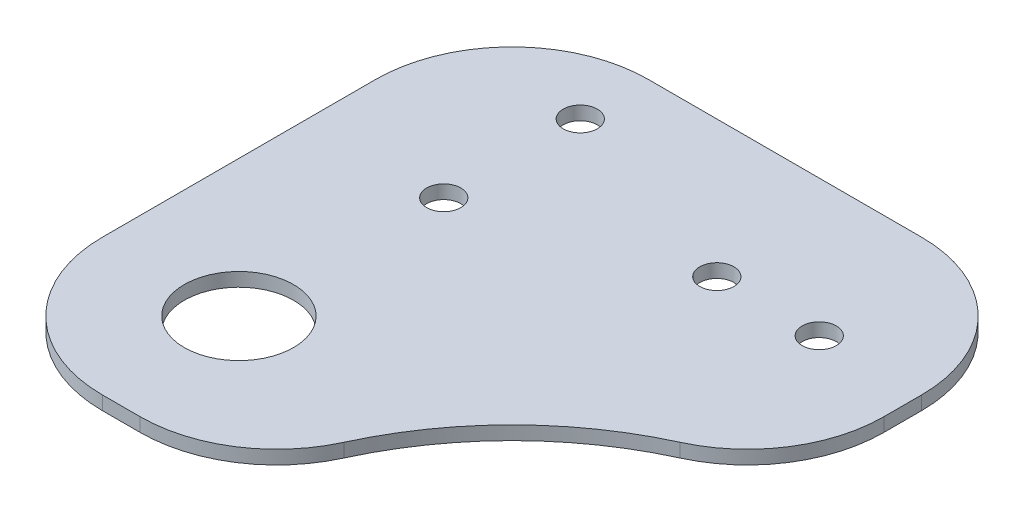
ISO-10303-21;
HEADER;
FILE_DESCRIPTION(('STEP AP214'),'2;1');
FILE_NAME('part.step','',(''),(''),'','','');
FILE_SCHEMA(('AUTOMOTIVE_DESIGN { 1 0 10303 214 1 1 1 1 }'));
ENDSEC;
DATA;
#1=APPLICATION_CONTEXT('core data for automotive mechanical design processes');
#2=APPLICATION_PROTOCOL_DEFINITION('international standard','automotive_design',2000,#1);
#3=PRODUCT_CONTEXT('',#1,'mechanical');
#4=PRODUCT('Part','Part','',(#3));
#5=PRODUCT_RELATED_PRODUCT_CATEGORY('part','',(#4));
#6=PRODUCT_DEFINITION_FORMATION('','',#4);
#7=PRODUCT_DEFINITION_CONTEXT('part definition',#1,'design');
#8=PRODUCT_DEFINITION('design','',#6,#7);
#9=PRODUCT_DEFINITION_SHAPE('','',#8);
#10=(LENGTH_UNIT() NAMED_UNIT(*) SI_UNIT(.MILLI.,.METRE.));
#11=(NAMED_UNIT(*) PLANE_ANGLE_UNIT() SI_UNIT($,.RADIAN.));
#12=(NAMED_UNIT(*) SI_UNIT($,.STERADIAN.) SOLID_ANGLE_UNIT());
#13=UNCERTAINTY_MEASURE_WITH_UNIT(LENGTH_MEASURE(1.E-05),#10,'distance_accuracy_value','');
#14=(GEOMETRIC_REPRESENTATION_CONTEXT(3) GLOBAL_UNCERTAINTY_ASSIGNED_CONTEXT((#13)) GLOBAL_UNIT_ASSIGNED_CONTEXT((#10,
#11,#12)) REPRESENTATION_CONTEXT('',''));
#15=CARTESIAN_POINT('',(0.,0.,0.));
#16=DIRECTION('',(0.,0.,1.));
#17=DIRECTION('',(1.,0.,0.));
#18=AXIS2_PLACEMENT_3D('',#15,#16,#17);
#19=CARTESIAN_POINT('',(0.,2.,-40.));
#20=DIRECTION('',(0.,0.,1.));
#21=DIRECTION('',(1.,0.,0.));
#22=AXIS2_PLACEMENT_3D('',#19,#20,#21);
#23=PLANE('',#22);
#24=DIRECTION('',(-1.,0.,0.));
#25=VECTOR('',#24,1.);
#26=CARTESIAN_POINT('',(0.,0.,-40.));
#27=LINE('',#26,#25);
#28=CARTESIAN_POINT('',(60.,0.,-40.));
#29=VERTEX_POINT('',#28);
#30=CARTESIAN_POINT('',(20.,0.,-40.));
#31=VERTEX_POINT('',#30);
#32=EDGE_CURVE('E143',#29,#31,#27,.T.);
#33=ORIENTED_EDGE('',*,*,#32,.T.);
#34=DIRECTION('',(0.,-1.,0.));
#35=VECTOR('',#34,1.);
#36=CARTESIAN_POINT('',(20.,2.,-40.));
#37=LINE('',#36,#35);
#38=CARTESIAN_POINT('',(20.,2.,-40.));
#39=VERTEX_POINT('',#38);
#40=EDGE_CURVE('E119',#31,#39,#37,.F.);
#41=ORIENTED_EDGE('',*,*,#40,.T.);
#42=DIRECTION('',(-1.,0.,0.));
#43=VECTOR('',#42,1.);
#44=CARTESIAN_POINT('',(0.,2.,-40.));
#45=LINE('',#44,#43);
#46=CARTESIAN_POINT('',(60.,2.,-40.));
#47=VERTEX_POINT('',#46);
#48=EDGE_CURVE('E284',#47,#39,#45,.T.);
#49=ORIENTED_EDGE('',*,*,#48,.F.);
#50=DIRECTION('',(0.,-1.,0.));
#51=VECTOR('',#50,1.);
#52=CARTESIAN_POINT('',(60.,0.,-40.));
#53=LINE('',#52,#51);
#54=EDGE_CURVE('E124',#47,#29,#53,.T.);
#55=ORIENTED_EDGE('',*,*,#54,.T.);
#56=EDGE_LOOP('',(#33,#41,#49,#55));
#57=FACE_BOUND('',#56,.T.);
#58=ADVANCED_FACE('F35',(#57),#23,.F.);
#59=CARTESIAN_POINT('',(0.,2.,0.));
#60=DIRECTION('',(1.,0.,0.));
#61=DIRECTION('',(0.,0.,-1.));
#62=AXIS2_PLACEMENT_3D('',#59,#60,#61);
#63=PLANE('',#62);
#64=DIRECTION('',(0.,0.,1.));
#65=VECTOR('',#64,1.);
#66=CARTESIAN_POINT('',(0.,2.,0.));
#67=LINE('',#66,#65);
#68=CARTESIAN_POINT('',(0.,2.,-20.));
#69=VERTEX_POINT('',#68);
#70=CARTESIAN_POINT('',(0.,2.,20.));
#71=VERTEX_POINT('',#70);
#72=EDGE_CURVE('E134',#69,#71,#67,.T.);
#73=ORIENTED_EDGE('',*,*,#72,.F.);
#74=DIRECTION('',(0.,-1.,0.));
#75=VECTOR('',#74,1.);
#76=CARTESIAN_POINT('',(0.,2.,-20.));
#77=LINE('',#76,#75);
#78=CARTESIAN_POINT('',(0.,0.,-20.));
#79=VERTEX_POINT('',#78);
#80=EDGE_CURVE('E118',#69,#79,#77,.T.);
#81=ORIENTED_EDGE('',*,*,#80,.T.);
#82=DIRECTION('',(0.,0.,1.));
#83=VECTOR('',#82,1.);
#84=CARTESIAN_POINT('',(0.,0.,0.));
#85=LINE('',#84,#83);
#86=CARTESIAN_POINT('',(0.,0.,20.));
#87=VERTEX_POINT('',#86);
#88=EDGE_CURVE('E131',#79,#87,#85,.T.);
#89=ORIENTED_EDGE('',*,*,#88,.T.);
#90=DIRECTION('',(0.,-1.,0.));
#91=VECTOR('',#90,1.);
#92=CARTESIAN_POINT('',(0.,2.,20.));
#93=LINE('',#92,#91);
#94=EDGE_CURVE('E136',#87,#71,#93,.F.);
#95=ORIENTED_EDGE('',*,*,#94,.T.);
#96=EDGE_LOOP('',(#73,#81,#89,#95));
#97=FACE_BOUND('',#96,.T.);
#98=ADVANCED_FACE('F130',(#97),#63,.F.);
#99=CARTESIAN_POINT('',(0.,2.,40.));
#100=DIRECTION('',(0.,0.,-1.));
#101=DIRECTION('',(-1.,0.,0.));
#102=AXIS2_PLACEMENT_3D('',#99,#100,#101);
#103=PLANE('',#102);
#104=DIRECTION('',(1.,0.,0.));
#105=VECTOR('',#104,1.);
#106=CARTESIAN_POINT('',(0.,2.,40.));
#107=LINE('',#106,#105);
#108=CARTESIAN_POINT('',(20.,2.,40.));
#109=VERTEX_POINT('',#108);
#110=CARTESIAN_POINT('',(25.5151491674372,2.,40.));
#111=VERTEX_POINT('',#110);
#112=EDGE_CURVE('E195',#109,#111,#107,.T.);
#113=ORIENTED_EDGE('',*,*,#112,.F.);
#114=DIRECTION('',(0.,-1.,0.));
#115=VECTOR('',#114,1.);
#116=CARTESIAN_POINT('',(20.,2.,40.));
#117=LINE('',#116,#115);
#118=CARTESIAN_POINT('',(20.,0.,40.));
#119=VERTEX_POINT('',#118);
#120=EDGE_CURVE('E11',#109,#119,#117,.T.);
#121=ORIENTED_EDGE('',*,*,#120,.T.);
#122=DIRECTION('',(1.,0.,0.));
#123=VECTOR('',#122,1.);
#124=CARTESIAN_POINT('',(0.,0.,40.));
#125=LINE('',#124,#123);
#126=CARTESIAN_POINT('',(25.5151491674372,0.,40.));
#127=VERTEX_POINT('',#126);
#128=EDGE_CURVE('E142',#119,#127,#125,.T.);
#129=ORIENTED_EDGE('',*,*,#128,.T.);
#130=DIRECTION('',(0.,1.,0.));
#131=VECTOR('',#130,1.);
#132=CARTESIAN_POINT('',(25.5151491674372,2.,40.));
#133=LINE('',#132,#131);
#134=EDGE_CURVE('E43',#127,#111,#133,.T.);
#135=ORIENTED_EDGE('',*,*,#134,.T.);
#136=EDGE_LOOP('',(#113,#121,#129,#135));
#137=FACE_BOUND('',#136,.T.);
#138=ADVANCED_FACE('F194',(#137),#103,.F.);
#139=CARTESIAN_POINT('',(80.,2.,0.));
#140=DIRECTION('',(1.,0.,0.));
#141=DIRECTION('',(0.,0.,-1.));
#142=AXIS2_PLACEMENT_3D('',#139,#140,#141);
#143=PLANE('',#142);
#144=DIRECTION('',(0.,0.,1.));
#145=VECTOR('',#144,1.);
#146=CARTESIAN_POINT('',(80.,2.,0.));
#147=LINE('',#146,#145);
#148=CARTESIAN_POINT('',(80.,2.,-20.));
#149=VERTEX_POINT('',#148);
#150=CARTESIAN_POINT('',(80.,2.,-14.4848508325628));
#151=VERTEX_POINT('',#150);
#152=EDGE_CURVE('E204',#149,#151,#147,.T.);
#153=ORIENTED_EDGE('',*,*,#152,.T.);
#154=DIRECTION('',(0.,-1.,0.));
#155=VECTOR('',#154,1.);
#156=CARTESIAN_POINT('',(80.,0.,-14.4848508325628));
#157=LINE('',#156,#155);
#158=CARTESIAN_POINT('',(80.,0.,-14.4848508325628));
#159=VERTEX_POINT('',#158);
#160=EDGE_CURVE('E183',#151,#159,#157,.T.);
#161=ORIENTED_EDGE('',*,*,#160,.T.);
#162=DIRECTION('',(0.,0.,1.));
#163=VECTOR('',#162,1.);
#164=CARTESIAN_POINT('',(80.,0.,0.));
#165=LINE('',#164,#163);
#166=CARTESIAN_POINT('',(80.,0.,-20.));
#167=VERTEX_POINT('',#166);
#168=EDGE_CURVE('E146',#167,#159,#165,.T.);
#169=ORIENTED_EDGE('',*,*,#168,.F.);
#170=DIRECTION('',(0.,-1.,0.));
#171=VECTOR('',#170,1.);
#172=CARTESIAN_POINT('',(80.,2.,-20.));
#173=LINE('',#172,#171);
#174=EDGE_CURVE('E57',#167,#149,#173,.F.);
#175=ORIENTED_EDGE('',*,*,#174,.T.);
#176=EDGE_LOOP('',(#153,#161,#169,#175));
#177=FACE_BOUND('',#176,.T.);
#178=ADVANCED_FACE('F214',(#177),#143,.T.);
#179=CARTESIAN_POINT('',(20.,2.,-10.));
#180=DIRECTION('',(0.,-1.,0.));
#181=DIRECTION('',(0.,0.,-1.));
#182=AXIS2_PLACEMENT_3D('',#179,#180,#181);
#183=CYLINDRICAL_SURFACE('',#182,2.5);
#184=CARTESIAN_POINT('',(20.,2.,-10.));
#185=DIRECTION('',(0.,1.,0.));
#186=DIRECTION('',(0.,0.,1.));
#187=AXIS2_PLACEMENT_3D('',#184,#185,#186);
#188=CIRCLE('',#187,2.5);
#189=CARTESIAN_POINT('',(20.,2.,-7.5));
#190=VERTEX_POINT('',#189);
#191=EDGE_CURVE('E283',#190,#190,#188,.T.);
#192=ORIENTED_EDGE('',*,*,#191,.T.);
#193=EDGE_LOOP('',(#192));
#194=FACE_BOUND('',#193,.T.);
#195=CARTESIAN_POINT('',(20.,0.,-10.));
#196=DIRECTION('',(0.,1.,0.));
#197=DIRECTION('',(0.,0.,1.));
#198=AXIS2_PLACEMENT_3D('',#195,#196,#197);
#199=CIRCLE('',#198,2.5);
#200=CARTESIAN_POINT('',(20.,0.,-7.5));
#201=VERTEX_POINT('',#200);
#202=EDGE_CURVE('E148',#201,#201,#199,.T.);
#203=ORIENTED_EDGE('',*,*,#202,.F.);
#204=EDGE_LOOP('',(#203));
#205=FACE_BOUND('',#204,.T.);
#206=ADVANCED_FACE('F233',(#194,#205),#183,.F.);
#207=CARTESIAN_POINT('',(65.,2.,-20.));
#208=DIRECTION('',(0.,-1.,0.));
#209=DIRECTION('',(0.,0.,-1.));
#210=AXIS2_PLACEMENT_3D('',#207,#208,#209);
#211=CYLINDRICAL_SURFACE('',#210,2.5);
#212=CARTESIAN_POINT('',(65.,2.,-20.));
#213=DIRECTION('',(0.,1.,0.));
#214=DIRECTION('',(0.,0.,1.));
#215=AXIS2_PLACEMENT_3D('',#212,#213,#214);
#216=CIRCLE('',#215,2.5);
#217=CARTESIAN_POINT('',(65.,2.,-17.5));
#218=VERTEX_POINT('',#217);
#219=EDGE_CURVE('E281',#218,#218,#216,.T.);
#220=ORIENTED_EDGE('',*,*,#219,.T.);
#221=EDGE_LOOP('',(#220));
#222=FACE_BOUND('',#221,.T.);
#223=CARTESIAN_POINT('',(65.,0.,-20.));
#224=DIRECTION('',(0.,1.,0.));
#225=DIRECTION('',(0.,0.,1.));
#226=AXIS2_PLACEMENT_3D('',#223,#224,#225);
#227=CIRCLE('',#226,2.5);
#228=CARTESIAN_POINT('',(65.,0.,-17.5));
#229=VERTEX_POINT('',#228);
#230=EDGE_CURVE('E227',#229,#229,#227,.T.);
#231=ORIENTED_EDGE('',*,*,#230,.F.);
#232=EDGE_LOOP('',(#231));
#233=FACE_BOUND('',#232,.T.);
#234=ADVANCED_FACE('F235',(#222,#233),#211,.F.);
#235=CARTESIAN_POINT('',(50.,2.,-20.));
#236=DIRECTION('',(0.,-1.,0.));
#237=DIRECTION('',(0.,0.,-1.));
#238=AXIS2_PLACEMENT_3D('',#235,#236,#237);
#239=CYLINDRICAL_SURFACE('',#238,2.5);
#240=CARTESIAN_POINT('',(50.,2.,-20.));
#241=DIRECTION('',(0.,1.,0.));
#242=DIRECTION('',(0.,0.,1.));
#243=AXIS2_PLACEMENT_3D('',#240,#241,#242);
#244=CIRCLE('',#243,2.5);
#245=CARTESIAN_POINT('',(50.,2.,-17.5));
#246=VERTEX_POINT('',#245);
#247=EDGE_CURVE('E277',#246,#246,#244,.T.);
#248=ORIENTED_EDGE('',*,*,#247,.T.);
#249=EDGE_LOOP('',(#248));
#250=FACE_BOUND('',#249,.T.);
#251=CARTESIAN_POINT('',(50.,0.,-20.));
#252=DIRECTION('',(0.,1.,0.));
#253=DIRECTION('',(0.,0.,1.));
#254=AXIS2_PLACEMENT_3D('',#251,#252,#253);
#255=CIRCLE('',#254,2.5);
#256=CARTESIAN_POINT('',(50.,0.,-17.5));
#257=VERTEX_POINT('',#256);
#258=EDGE_CURVE('E224',#257,#257,#255,.T.);
#259=ORIENTED_EDGE('',*,*,#258,.F.);
#260=EDGE_LOOP('',(#259));
#261=FACE_BOUND('',#260,.T.);
#262=ADVANCED_FACE('F242',(#250,#261),#239,.F.);
#263=CARTESIAN_POINT('',(20.,2.,-30.));
#264=DIRECTION('',(0.,-1.,0.));
#265=DIRECTION('',(0.,0.,-1.));
#266=AXIS2_PLACEMENT_3D('',#263,#264,#265);
#267=CYLINDRICAL_SURFACE('',#266,2.5);
#268=CARTESIAN_POINT('',(20.,2.,-30.));
#269=DIRECTION('',(0.,1.,0.));
#270=DIRECTION('',(0.,0.,1.));
#271=AXIS2_PLACEMENT_3D('',#268,#269,#270);
#272=CIRCLE('',#271,2.5);
#273=CARTESIAN_POINT('',(20.,2.,-27.5));
#274=VERTEX_POINT('',#273);
#275=EDGE_CURVE('E157',#274,#274,#272,.T.);
#276=ORIENTED_EDGE('',*,*,#275,.T.);
#277=EDGE_LOOP('',(#276));
#278=FACE_BOUND('',#277,.T.);
#279=CARTESIAN_POINT('',(20.,0.,-30.));
#280=DIRECTION('',(0.,1.,0.));
#281=DIRECTION('',(0.,0.,1.));
#282=AXIS2_PLACEMENT_3D('',#279,#280,#281);
#283=CIRCLE('',#282,2.5);
#284=CARTESIAN_POINT('',(20.,0.,-27.5));
#285=VERTEX_POINT('',#284);
#286=EDGE_CURVE('E221',#285,#285,#283,.T.);
#287=ORIENTED_EDGE('',*,*,#286,.F.);
#288=EDGE_LOOP('',(#287));
#289=FACE_BOUND('',#288,.T.);
#290=ADVANCED_FACE('F262',(#278,#289),#267,.F.);
#291=CARTESIAN_POINT('',(20.,2.,20.));
#292=DIRECTION('',(0.,-1.,0.));
#293=DIRECTION('',(0.,0.,-1.));
#294=AXIS2_PLACEMENT_3D('',#291,#292,#293);
#295=CYLINDRICAL_SURFACE('',#294,8.);
#296=CARTESIAN_POINT('',(20.,2.,20.));
#297=DIRECTION('',(0.,1.,0.));
#298=DIRECTION('',(0.,0.,1.));
#299=AXIS2_PLACEMENT_3D('',#296,#297,#298);
#300=CIRCLE('',#299,8.);
#301=CARTESIAN_POINT('',(20.,2.,28.));
#302=VERTEX_POINT('',#301);
#303=EDGE_CURVE('E162',#302,#302,#300,.T.);
#304=ORIENTED_EDGE('',*,*,#303,.T.);
#305=EDGE_LOOP('',(#304));
#306=FACE_BOUND('',#305,.T.);
#307=CARTESIAN_POINT('',(20.,0.,20.));
#308=DIRECTION('',(0.,1.,0.));
#309=DIRECTION('',(0.,0.,1.));
#310=AXIS2_PLACEMENT_3D('',#307,#308,#309);
#311=CIRCLE('',#310,8.);
#312=CARTESIAN_POINT('',(20.,0.,28.));
#313=VERTEX_POINT('',#312);
#314=EDGE_CURVE('E154',#313,#313,#311,.T.);
#315=ORIENTED_EDGE('',*,*,#314,.F.);
#316=EDGE_LOOP('',(#315));
#317=FACE_BOUND('',#316,.T.);
#318=ADVANCED_FACE('F259',(#306,#317),#295,.F.);
#319=CARTESIAN_POINT('',(0.,2.,0.));
#320=DIRECTION('',(0.,1.,0.));
#321=DIRECTION('',(0.,0.,1.));
#322=AXIS2_PLACEMENT_3D('',#319,#320,#321);
#323=PLANE('',#322);
#324=ORIENTED_EDGE('',*,*,#275,.F.);
#325=EDGE_LOOP('',(#324));
#326=FACE_BOUND('',#325,.T.);
#327=ORIENTED_EDGE('',*,*,#247,.F.);
#328=EDGE_LOOP('',(#327));
#329=FACE_BOUND('',#328,.T.);
#330=ORIENTED_EDGE('',*,*,#219,.F.);
#331=EDGE_LOOP('',(#330));
#332=FACE_BOUND('',#331,.T.);
#333=ORIENTED_EDGE('',*,*,#191,.F.);
#334=EDGE_LOOP('',(#333));
#335=FACE_BOUND('',#334,.T.);
#336=ORIENTED_EDGE('',*,*,#48,.T.);
#337=CARTESIAN_POINT('',(20.,2.,-20.));
#338=DIRECTION('',(0.,1.,0.));
#339=DIRECTION('',(0.,0.,1.));
#340=AXIS2_PLACEMENT_3D('',#337,#338,#339);
#341=CIRCLE('',#340,20.);
#342=EDGE_CURVE('E180',#39,#69,#341,.T.);
#343=ORIENTED_EDGE('',*,*,#342,.T.);
#344=ORIENTED_EDGE('',*,*,#72,.T.);
#345=CARTESIAN_POINT('',(20.,2.,20.));
#346=DIRECTION('',(0.,1.,0.));
#347=DIRECTION('',(0.,0.,1.));
#348=AXIS2_PLACEMENT_3D('',#345,#346,#347);
#349=CIRCLE('',#348,20.);
#350=EDGE_CURVE('E175',#71,#109,#349,.T.);
#351=ORIENTED_EDGE('',*,*,#350,.T.);
#352=ORIENTED_EDGE('',*,*,#112,.T.);
#353=CARTESIAN_POINT('',(25.5151491674372,2.,20.));
#354=DIRECTION('',(0.,1.,0.));
#355=DIRECTION('',(0.,0.,1.));
#356=AXIS2_PLACEMENT_3D('',#353,#354,#355);
#357=CIRCLE('',#356,20.);
#358=CARTESIAN_POINT('',(43.697894969377,2.,28.3299312783504));
#359=VERTEX_POINT('',#358);
#360=EDGE_CURVE('E173',#111,#359,#357,.T.);
#361=ORIENTED_EDGE('',*,*,#360,.T.);
#362=CARTESIAN_POINT('',(89.1547594742265,2.,49.1547594742265));
#363=DIRECTION('',(0.,1.,0.));
#364=DIRECTION('',(0.,0.,1.));
#365=AXIS2_PLACEMENT_3D('',#362,#363,#364);
#366=CIRCLE('',#365,50.);
#367=CARTESIAN_POINT('',(68.3299312783504,2.,3.69789496937702));
#368=VERTEX_POINT('',#367);
#369=EDGE_CURVE('E161',#359,#368,#366,.F.);
#370=ORIENTED_EDGE('',*,*,#369,.T.);
#371=CARTESIAN_POINT('',(60.,2.,-14.4848508325628));
#372=DIRECTION('',(0.,1.,0.));
#373=DIRECTION('',(0.,0.,1.));
#374=AXIS2_PLACEMENT_3D('',#371,#372,#373);
#375=CIRCLE('',#374,20.);
#376=EDGE_CURVE('E50',#368,#151,#375,.T.);
#377=ORIENTED_EDGE('',*,*,#376,.T.);
#378=ORIENTED_EDGE('',*,*,#152,.F.);
#379=CARTESIAN_POINT('',(60.,2.,-20.));
#380=DIRECTION('',(0.,1.,0.));
#381=DIRECTION('',(0.,0.,1.));
#382=AXIS2_PLACEMENT_3D('',#379,#380,#381);
#383=CIRCLE('',#382,20.);
#384=EDGE_CURVE('E177',#149,#47,#383,.T.);
#385=ORIENTED_EDGE('',*,*,#384,.T.);
#386=EDGE_LOOP('',(#336,#343,#344,#351,#352,#361,#370,#377,#378,#385));
#387=FACE_BOUND('',#386,.T.);
#388=ORIENTED_EDGE('',*,*,#303,.F.);
#389=EDGE_LOOP('',(#388));
#390=FACE_BOUND('',#389,.T.);
#391=ADVANCED_FACE('F200',(#326,#329,#332,#335,#387,#390),#323,.T.);
#392=CARTESIAN_POINT('',(0.,0.,0.));
#393=DIRECTION('',(0.,1.,0.));
#394=DIRECTION('',(0.,0.,1.));
#395=AXIS2_PLACEMENT_3D('',#392,#393,#394);
#396=PLANE('',#395);
#397=ORIENTED_EDGE('',*,*,#286,.T.);
#398=EDGE_LOOP('',(#397));
#399=FACE_BOUND('',#398,.T.);
#400=ORIENTED_EDGE('',*,*,#258,.T.);
#401=EDGE_LOOP('',(#400));
#402=FACE_BOUND('',#401,.T.);
#403=ORIENTED_EDGE('',*,*,#230,.T.);
#404=EDGE_LOOP('',(#403));
#405=FACE_BOUND('',#404,.T.);
#406=ORIENTED_EDGE('',*,*,#202,.T.);
#407=EDGE_LOOP('',(#406));
#408=FACE_BOUND('',#407,.T.);
#409=ORIENTED_EDGE('',*,*,#88,.F.);
#410=CARTESIAN_POINT('',(20.,0.,-20.));
#411=DIRECTION('',(0.,1.,0.));
#412=DIRECTION('',(0.,0.,1.));
#413=AXIS2_PLACEMENT_3D('',#410,#411,#412);
#414=CIRCLE('',#413,20.);
#415=EDGE_CURVE('E114',#79,#31,#414,.F.);
#416=ORIENTED_EDGE('',*,*,#415,.T.);
#417=ORIENTED_EDGE('',*,*,#32,.F.);
#418=CARTESIAN_POINT('',(60.,0.,-20.));
#419=DIRECTION('',(0.,1.,0.));
#420=DIRECTION('',(0.,0.,1.));
#421=AXIS2_PLACEMENT_3D('',#418,#419,#420);
#422=CIRCLE('',#421,20.);
#423=EDGE_CURVE('E167',#29,#167,#422,.F.);
#424=ORIENTED_EDGE('',*,*,#423,.T.);
#425=ORIENTED_EDGE('',*,*,#168,.T.);
#426=CARTESIAN_POINT('',(60.,0.,-14.4848508325628));
#427=DIRECTION('',(0.,1.,0.));
#428=DIRECTION('',(0.,0.,1.));
#429=AXIS2_PLACEMENT_3D('',#426,#427,#428);
#430=CIRCLE('',#429,20.);
#431=CARTESIAN_POINT('',(68.3299312783504,0.,3.69789496937702));
#432=VERTEX_POINT('',#431);
#433=EDGE_CURVE('E125',#159,#432,#430,.F.);
#434=ORIENTED_EDGE('',*,*,#433,.T.);
#435=CARTESIAN_POINT('',(89.1547594742265,0.,49.1547594742265));
#436=DIRECTION('',(0.,1.,0.));
#437=DIRECTION('',(0.,0.,1.));
#438=AXIS2_PLACEMENT_3D('',#435,#436,#437);
#439=CIRCLE('',#438,50.);
#440=CARTESIAN_POINT('',(43.697894969377,0.,28.3299312783504));
#441=VERTEX_POINT('',#440);
#442=EDGE_CURVE('E158',#432,#441,#439,.T.);
#443=ORIENTED_EDGE('',*,*,#442,.T.);
#444=CARTESIAN_POINT('',(25.5151491674372,0.,20.));
#445=DIRECTION('',(0.,1.,0.));
#446=DIRECTION('',(0.,0.,1.));
#447=AXIS2_PLACEMENT_3D('',#444,#445,#446);
#448=CIRCLE('',#447,20.);
#449=EDGE_CURVE('E135',#441,#127,#448,.F.);
#450=ORIENTED_EDGE('',*,*,#449,.T.);
#451=ORIENTED_EDGE('',*,*,#128,.F.);
#452=CARTESIAN_POINT('',(20.,0.,20.));
#453=DIRECTION('',(0.,1.,0.));
#454=DIRECTION('',(0.,0.,1.));
#455=AXIS2_PLACEMENT_3D('',#452,#453,#454);
#456=CIRCLE('',#455,20.);
#457=EDGE_CURVE('E141',#119,#87,#456,.F.);
#458=ORIENTED_EDGE('',*,*,#457,.T.);
#459=EDGE_LOOP('',(#409,#416,#417,#424,#425,#434,#443,#450,#451,#458));
#460=FACE_BOUND('',#459,.T.);
#461=ORIENTED_EDGE('',*,*,#314,.T.);
#462=EDGE_LOOP('',(#461));
#463=FACE_BOUND('',#462,.T.);
#464=ADVANCED_FACE('F138',(#399,#402,#405,#408,#460,#463),#396,.F.);
#465=CARTESIAN_POINT('',(89.1547594742265,2.,49.1547594742265));
#466=DIRECTION('',(0.,1.,0.));
#467=DIRECTION('',(0.,0.,1.));
#468=AXIS2_PLACEMENT_3D('',#465,#466,#467);
#469=CYLINDRICAL_SURFACE('',#468,50.);
#470=ORIENTED_EDGE('',*,*,#442,.F.);
#471=DIRECTION('',(0.,1.,0.));
#472=VECTOR('',#471,1.);
#473=CARTESIAN_POINT('',(68.3299312783504,2.,3.69789496937702));
#474=LINE('',#473,#472);
#475=EDGE_CURVE('E189',#432,#368,#474,.T.);
#476=ORIENTED_EDGE('',*,*,#475,.T.);
#477=ORIENTED_EDGE('',*,*,#369,.F.);
#478=DIRECTION('',(0.,1.,0.));
#479=VECTOR('',#478,1.);
#480=CARTESIAN_POINT('',(43.697894969377,2.,28.3299312783504));
#481=LINE('',#480,#479);
#482=EDGE_CURVE('E186',#359,#441,#481,.F.);
#483=ORIENTED_EDGE('',*,*,#482,.T.);
#484=EDGE_LOOP('',(#470,#476,#477,#483));
#485=FACE_BOUND('',#484,.T.);
#486=ADVANCED_FACE('F209',(#485),#469,.F.);
#487=CARTESIAN_POINT('',(20.,2.,-20.));
#488=DIRECTION('',(0.,-1.,0.));
#489=DIRECTION('',(0.,0.,-1.));
#490=AXIS2_PLACEMENT_3D('',#487,#488,#489);
#491=CYLINDRICAL_SURFACE('',#490,20.);
#492=ORIENTED_EDGE('',*,*,#342,.F.);
#493=ORIENTED_EDGE('',*,*,#40,.F.);
#494=ORIENTED_EDGE('',*,*,#415,.F.);
#495=ORIENTED_EDGE('',*,*,#80,.F.);
#496=EDGE_LOOP('',(#492,#493,#494,#495));
#497=FACE_BOUND('',#496,.T.);
#498=ADVANCED_FACE('F117',(#497),#491,.T.);
#499=CARTESIAN_POINT('',(60.,2.,-14.4848508325628));
#500=DIRECTION('',(0.,1.,0.));
#501=DIRECTION('',(0.,0.,1.));
#502=AXIS2_PLACEMENT_3D('',#499,#500,#501);
#503=CYLINDRICAL_SURFACE('',#502,20.);
#504=ORIENTED_EDGE('',*,*,#376,.F.);
#505=ORIENTED_EDGE('',*,*,#475,.F.);
#506=ORIENTED_EDGE('',*,*,#433,.F.);
#507=ORIENTED_EDGE('',*,*,#160,.F.);
#508=EDGE_LOOP('',(#504,#505,#506,#507));
#509=FACE_BOUND('',#508,.T.);
#510=ADVANCED_FACE('F213',(#509),#503,.T.);
#511=CARTESIAN_POINT('',(60.,2.,-20.));
#512=DIRECTION('',(0.,1.,0.));
#513=DIRECTION('',(0.,0.,1.));
#514=AXIS2_PLACEMENT_3D('',#511,#512,#513);
#515=CYLINDRICAL_SURFACE('',#514,20.);
#516=ORIENTED_EDGE('',*,*,#384,.F.);
#517=ORIENTED_EDGE('',*,*,#174,.F.);
#518=ORIENTED_EDGE('',*,*,#423,.F.);
#519=ORIENTED_EDGE('',*,*,#54,.F.);
#520=EDGE_LOOP('',(#516,#517,#518,#519));
#521=FACE_BOUND('',#520,.T.);
#522=ADVANCED_FACE('F292',(#521),#515,.T.);
#523=CARTESIAN_POINT('',(20.,2.,20.));
#524=DIRECTION('',(0.,-1.,0.));
#525=DIRECTION('',(0.,0.,-1.));
#526=AXIS2_PLACEMENT_3D('',#523,#524,#525);
#527=CYLINDRICAL_SURFACE('',#526,20.);
#528=ORIENTED_EDGE('',*,*,#350,.F.);
#529=ORIENTED_EDGE('',*,*,#94,.F.);
#530=ORIENTED_EDGE('',*,*,#457,.F.);
#531=ORIENTED_EDGE('',*,*,#120,.F.);
#532=EDGE_LOOP('',(#528,#529,#530,#531));
#533=FACE_BOUND('',#532,.T.);
#534=ADVANCED_FACE('F290',(#533),#527,.T.);
#535=CARTESIAN_POINT('',(25.5151491674372,2.,20.));
#536=DIRECTION('',(0.,1.,0.));
#537=DIRECTION('',(0.,0.,1.));
#538=AXIS2_PLACEMENT_3D('',#535,#536,#537);
#539=CYLINDRICAL_SURFACE('',#538,20.);
#540=ORIENTED_EDGE('',*,*,#360,.F.);
#541=ORIENTED_EDGE('',*,*,#134,.F.);
#542=ORIENTED_EDGE('',*,*,#449,.F.);
#543=ORIENTED_EDGE('',*,*,#482,.F.);
#544=EDGE_LOOP('',(#540,#541,#542,#543));
#545=FACE_BOUND('',#544,.T.);
#546=ADVANCED_FACE('F37',(#545),#539,.T.);
#547=CLOSED_SHELL('',(#58,#98,#138,#178,#206,#234,#262,#290,#318,#391,#464,#486,#498,#510,#522,
#534,#546));
#548=MANIFOLD_SOLID_BREP('B2',#547);
#549=ADVANCED_BREP_SHAPE_REPRESENTATION('',(#18,#548),#14);
#550=SHAPE_DEFINITION_REPRESENTATION(#9,#549);
ENDSEC;
END-ISO-10303-21;
